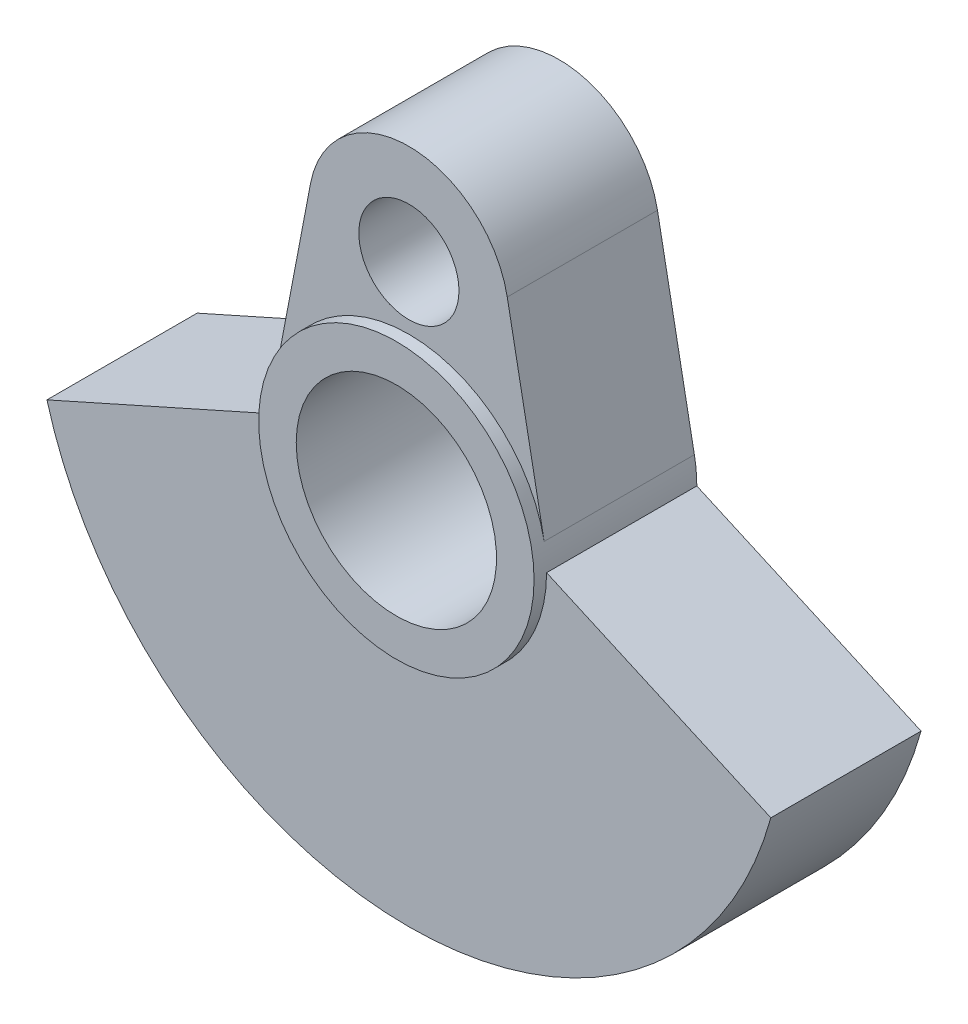
ISO-10303-21;
HEADER;
FILE_DESCRIPTION(('STEP AP214'),'2;1');
FILE_NAME('part.step','',(''),(''),'','','');
FILE_SCHEMA(('AUTOMOTIVE_DESIGN { 1 0 10303 214 1 1 1 1 }'));
ENDSEC;
DATA;
#1=APPLICATION_CONTEXT('core data for automotive mechanical design processes');
#2=APPLICATION_PROTOCOL_DEFINITION('international standard','automotive_design',2000,#1);
#3=PRODUCT_CONTEXT('',#1,'mechanical');
#4=PRODUCT('Part','Part','',(#3));
#5=PRODUCT_RELATED_PRODUCT_CATEGORY('part','',(#4));
#6=PRODUCT_DEFINITION_FORMATION('','',#4);
#7=PRODUCT_DEFINITION_CONTEXT('part definition',#1,'design');
#8=PRODUCT_DEFINITION('design','',#6,#7);
#9=PRODUCT_DEFINITION_SHAPE('','',#8);
#10=(LENGTH_UNIT() NAMED_UNIT(*) SI_UNIT(.MILLI.,.METRE.));
#11=(NAMED_UNIT(*) PLANE_ANGLE_UNIT() SI_UNIT($,.RADIAN.));
#12=(NAMED_UNIT(*) SI_UNIT($,.STERADIAN.) SOLID_ANGLE_UNIT());
#13=UNCERTAINTY_MEASURE_WITH_UNIT(LENGTH_MEASURE(1.E-05),#10,'distance_accuracy_value','');
#14=(GEOMETRIC_REPRESENTATION_CONTEXT(3) GLOBAL_UNCERTAINTY_ASSIGNED_CONTEXT((#13)) GLOBAL_UNIT_ASSIGNED_CONTEXT((#10,
#11,#12)) REPRESENTATION_CONTEXT('',''));
#15=CARTESIAN_POINT('',(0.,0.,0.));
#16=DIRECTION('',(0.,0.,1.));
#17=DIRECTION('',(1.,0.,0.));
#18=AXIS2_PLACEMENT_3D('',#15,#16,#17);
#19=CARTESIAN_POINT('',(0.,0.,3.5));
#20=DIRECTION('',(0.,0.,-1.));
#21=DIRECTION('',(-1.,0.,0.));
#22=AXIS2_PLACEMENT_3D('',#19,#20,#21);
#23=CYLINDRICAL_SURFACE('',#22,5.5);
#24=CARTESIAN_POINT('',(0.,0.,3.5));
#25=DIRECTION('',(0.,0.,1.));
#26=DIRECTION('',(1.,0.,0.));
#27=AXIS2_PLACEMENT_3D('',#24,#25,#26);
#28=CIRCLE('',#27,5.5);
#29=CARTESIAN_POINT('',(5.5,0.,3.5));
#30=VERTEX_POINT('',#29);
#31=EDGE_CURVE('E153',#30,#30,#28,.T.);
#32=ORIENTED_EDGE('',*,*,#31,.F.);
#33=EDGE_LOOP('',(#32));
#34=FACE_BOUND('',#33,.T.);
#35=DIRECTION('',(0.,0.,-1.));
#36=VECTOR('',#35,1.);
#37=CARTESIAN_POINT('',(5.40245531564122,1.03125,3.));
#38=LINE('',#37,#36);
#39=CARTESIAN_POINT('',(5.40245531564122,1.03125,3.));
#40=VERTEX_POINT('',#39);
#41=CARTESIAN_POINT('',(5.40245531564121,1.03125,-3.));
#42=VERTEX_POINT('',#41);
#43=EDGE_CURVE('E62',#40,#42,#38,.T.);
#44=ORIENTED_EDGE('',*,*,#43,.F.);
#45=CARTESIAN_POINT('',(0.,0.,3.));
#46=DIRECTION('',(0.,0.,1.));
#47=DIRECTION('',(1.,0.,0.));
#48=AXIS2_PLACEMENT_3D('',#45,#46,#47);
#49=CIRCLE('',#48,5.5);
#50=CARTESIAN_POINT('',(-5.40245531564122,1.03125,3.));
#51=VERTEX_POINT('',#50);
#52=EDGE_CURVE('E57',#40,#51,#49,.T.);
#53=ORIENTED_EDGE('',*,*,#52,.T.);
#54=DIRECTION('',(0.,0.,-1.));
#55=VECTOR('',#54,1.);
#56=CARTESIAN_POINT('',(-5.40245531564122,1.03125,3.));
#57=LINE('',#56,#55);
#58=CARTESIAN_POINT('',(-5.40245531564122,1.03125,-3.));
#59=VERTEX_POINT('',#58);
#60=EDGE_CURVE('E144',#51,#59,#57,.T.);
#61=ORIENTED_EDGE('',*,*,#60,.T.);
#62=CARTESIAN_POINT('',(0.,0.,-3.));
#63=DIRECTION('',(0.,0.,1.));
#64=DIRECTION('',(1.,0.,0.));
#65=AXIS2_PLACEMENT_3D('',#62,#63,#64);
#66=CIRCLE('',#65,5.5);
#67=CARTESIAN_POINT('',(-5.5,0.,-3.));
#68=VERTEX_POINT('',#67);
#69=EDGE_CURVE('E150',#59,#68,#66,.T.);
#70=ORIENTED_EDGE('',*,*,#69,.T.);
#71=DIRECTION('',(0.,0.,-1.));
#72=VECTOR('',#71,1.);
#73=CARTESIAN_POINT('',(-5.5,0.,3.));
#74=LINE('',#73,#72);
#75=CARTESIAN_POINT('',(-5.5,0.,3.));
#76=VERTEX_POINT('',#75);
#77=EDGE_CURVE('E170',#76,#68,#74,.T.);
#78=ORIENTED_EDGE('',*,*,#77,.F.);
#79=CARTESIAN_POINT('',(0.,0.,3.));
#80=DIRECTION('',(0.,0.,1.));
#81=DIRECTION('',(1.,0.,0.));
#82=AXIS2_PLACEMENT_3D('',#79,#80,#81);
#83=CIRCLE('',#82,5.5);
#84=CARTESIAN_POINT('',(5.5,0.,3.));
#85=VERTEX_POINT('',#84);
#86=EDGE_CURVE('E168',#76,#85,#83,.T.);
#87=ORIENTED_EDGE('',*,*,#86,.T.);
#88=DIRECTION('',(0.,0.,-1.));
#89=VECTOR('',#88,1.);
#90=CARTESIAN_POINT('',(5.5,0.,3.));
#91=LINE('',#90,#89);
#92=CARTESIAN_POINT('',(5.5,0.,-3.));
#93=VERTEX_POINT('',#92);
#94=EDGE_CURVE('E180',#85,#93,#91,.T.);
#95=ORIENTED_EDGE('',*,*,#94,.T.);
#96=EDGE_CURVE('E157',#93,#42,#66,.T.);
#97=ORIENTED_EDGE('',*,*,#96,.T.);
#98=EDGE_LOOP('',(#44,#53,#61,#70,#78,#87,#95,#97));
#99=FACE_BOUND('',#98,.T.);
#100=ADVANCED_FACE('F42',(#34,#99),#23,.T.);
#101=CARTESIAN_POINT('',(-0.91452472822436,2.04781115503851,3.));
#102=DIRECTION('',(-0.407771042759929,0.9130842111692,0.));
#103=DIRECTION('',(-0.9130842111692,-0.407771042759929,0.));
#104=AXIS2_PLACEMENT_3D('',#101,#102,#103);
#105=PLANE('',#104);
#106=DIRECTION('',(0.9130842111692,0.407771042759929,0.));
#107=VECTOR('',#106,1.);
#108=CARTESIAN_POINT('',(-0.91452472822436,2.04781115503851,-3.));
#109=LINE('',#108,#107);
#110=CARTESIAN_POINT('',(-14.456832294801,-4.,-3.));
#111=VERTEX_POINT('',#110);
#112=EDGE_CURVE('E156',#111,#68,#109,.T.);
#113=ORIENTED_EDGE('',*,*,#112,.F.);
#114=DIRECTION('',(0.,0.,-1.));
#115=VECTOR('',#114,1.);
#116=CARTESIAN_POINT('',(-14.456832294801,-4.,3.));
#117=LINE('',#116,#115);
#118=CARTESIAN_POINT('',(-14.456832294801,-4.,3.));
#119=VERTEX_POINT('',#118);
#120=EDGE_CURVE('E12',#119,#111,#117,.T.);
#121=ORIENTED_EDGE('',*,*,#120,.F.);
#122=DIRECTION('',(0.9130842111692,0.407771042759929,0.));
#123=VECTOR('',#122,1.);
#124=CARTESIAN_POINT('',(-0.91452472822436,2.04781115503851,3.));
#125=LINE('',#124,#123);
#126=EDGE_CURVE('E159',#119,#76,#125,.T.);
#127=ORIENTED_EDGE('',*,*,#126,.T.);
#128=ORIENTED_EDGE('',*,*,#77,.T.);
#129=EDGE_LOOP('',(#113,#121,#127,#128));
#130=FACE_BOUND('',#129,.T.);
#131=ADVANCED_FACE('F44',(#130),#105,.T.);
#132=CARTESIAN_POINT('',(0.,0.,3.));
#133=DIRECTION('',(0.,0.,-1.));
#134=DIRECTION('',(-1.,0.,0.));
#135=AXIS2_PLACEMENT_3D('',#132,#133,#134);
#136=CYLINDRICAL_SURFACE('',#135,15.);
#137=CARTESIAN_POINT('',(0.,0.,-3.));
#138=DIRECTION('',(0.,0.,1.));
#139=DIRECTION('',(1.,0.,0.));
#140=AXIS2_PLACEMENT_3D('',#137,#138,#139);
#141=CIRCLE('',#140,15.);
#142=CARTESIAN_POINT('',(14.456832294801,-4.,-3.));
#143=VERTEX_POINT('',#142);
#144=EDGE_CURVE('E173',#111,#143,#141,.T.);
#145=ORIENTED_EDGE('',*,*,#144,.T.);
#146=DIRECTION('',(0.,0.,-1.));
#147=VECTOR('',#146,1.);
#148=CARTESIAN_POINT('',(14.456832294801,-4.,3.));
#149=LINE('',#148,#147);
#150=CARTESIAN_POINT('',(14.456832294801,-4.,3.));
#151=VERTEX_POINT('',#150);
#152=EDGE_CURVE('E50',#151,#143,#149,.T.);
#153=ORIENTED_EDGE('',*,*,#152,.F.);
#154=CARTESIAN_POINT('',(0.,0.,3.));
#155=DIRECTION('',(0.,0.,1.));
#156=DIRECTION('',(1.,0.,0.));
#157=AXIS2_PLACEMENT_3D('',#154,#155,#156);
#158=CIRCLE('',#157,15.);
#159=EDGE_CURVE('E162',#119,#151,#158,.T.);
#160=ORIENTED_EDGE('',*,*,#159,.F.);
#161=ORIENTED_EDGE('',*,*,#120,.T.);
#162=EDGE_LOOP('',(#145,#153,#160,#161));
#163=FACE_BOUND('',#162,.T.);
#164=ADVANCED_FACE('F191',(#163),#136,.T.);
#165=CARTESIAN_POINT('',(0.91452472822436,2.04781115503851,3.));
#166=DIRECTION('',(0.407771042759929,0.9130842111692,0.));
#167=DIRECTION('',(-0.9130842111692,0.407771042759929,0.));
#168=AXIS2_PLACEMENT_3D('',#165,#166,#167);
#169=PLANE('',#168);
#170=DIRECTION('',(0.9130842111692,-0.407771042759929,0.));
#171=VECTOR('',#170,1.);
#172=CARTESIAN_POINT('',(0.91452472822436,2.04781115503851,-3.));
#173=LINE('',#172,#171);
#174=EDGE_CURVE('E163',#93,#143,#173,.T.);
#175=ORIENTED_EDGE('',*,*,#174,.F.);
#176=ORIENTED_EDGE('',*,*,#94,.F.);
#177=DIRECTION('',(0.9130842111692,-0.407771042759929,0.));
#178=VECTOR('',#177,1.);
#179=CARTESIAN_POINT('',(0.91452472822436,2.04781115503851,3.));
#180=LINE('',#179,#178);
#181=EDGE_CURVE('E165',#85,#151,#180,.T.);
#182=ORIENTED_EDGE('',*,*,#181,.T.);
#183=ORIENTED_EDGE('',*,*,#152,.T.);
#184=EDGE_LOOP('',(#175,#176,#182,#183));
#185=FACE_BOUND('',#184,.T.);
#186=ADVANCED_FACE('F185',(#185),#169,.T.);
#187=CARTESIAN_POINT('',(0.,0.,3.));
#188=DIRECTION('',(0.,0.,1.));
#189=DIRECTION('',(1.,0.,0.));
#190=AXIS2_PLACEMENT_3D('',#187,#188,#189);
#191=PLANE('',#190);
#192=ORIENTED_EDGE('',*,*,#126,.F.);
#193=ORIENTED_EDGE('',*,*,#159,.T.);
#194=ORIENTED_EDGE('',*,*,#181,.F.);
#195=ORIENTED_EDGE('',*,*,#86,.F.);
#196=EDGE_LOOP('',(#192,#193,#194,#195));
#197=FACE_BOUND('',#196,.T.);
#198=ADVANCED_FACE('F199',(#197),#191,.T.);
#199=CARTESIAN_POINT('',(0.,0.,-3.));
#200=DIRECTION('',(0.,0.,1.));
#201=DIRECTION('',(1.,0.,0.));
#202=AXIS2_PLACEMENT_3D('',#199,#200,#201);
#203=PLANE('',#202);
#204=ORIENTED_EDGE('',*,*,#112,.T.);
#205=ORIENTED_EDGE('',*,*,#69,.F.);
#206=DIRECTION('',(-0.1875,-0.982264602843857,0.));
#207=VECTOR('',#206,1.);
#208=CARTESIAN_POINT('',(-5.40245531564122,1.03125,-3.));
#209=LINE('',#208,#207);
#210=CARTESIAN_POINT('',(-3.92905841137543,8.75,-3.));
#211=VERTEX_POINT('',#210);
#212=EDGE_CURVE('E130',#211,#59,#209,.T.);
#213=ORIENTED_EDGE('',*,*,#212,.F.);
#214=CARTESIAN_POINT('',(0.,8.,-3.));
#215=DIRECTION('',(0.,0.,1.));
#216=DIRECTION('',(1.,0.,0.));
#217=AXIS2_PLACEMENT_3D('',#214,#215,#216);
#218=CIRCLE('',#217,4.);
#219=CARTESIAN_POINT('',(3.92905841137543,8.75,-3.));
#220=VERTEX_POINT('',#219);
#221=EDGE_CURVE('E139',#220,#211,#218,.T.);
#222=ORIENTED_EDGE('',*,*,#221,.F.);
#223=DIRECTION('',(0.1875,-0.982264602843857,0.));
#224=VECTOR('',#223,1.);
#225=CARTESIAN_POINT('',(5.40245531564122,1.03125,-3.));
#226=LINE('',#225,#224);
#227=EDGE_CURVE('E111',#220,#42,#226,.T.);
#228=ORIENTED_EDGE('',*,*,#227,.T.);
#229=ORIENTED_EDGE('',*,*,#96,.F.);
#230=ORIENTED_EDGE('',*,*,#174,.T.);
#231=ORIENTED_EDGE('',*,*,#144,.F.);
#232=EDGE_LOOP('',(#204,#205,#213,#222,#228,#229,#230,#231));
#233=FACE_BOUND('',#232,.T.);
#234=CARTESIAN_POINT('',(0.,0.,-3.));
#235=DIRECTION('',(0.,0.,1.));
#236=DIRECTION('',(1.,0.,0.));
#237=AXIS2_PLACEMENT_3D('',#234,#235,#236);
#238=CIRCLE('',#237,4.);
#239=CARTESIAN_POINT('',(-4.,0.,-3.));
#240=VERTEX_POINT('',#239);
#241=EDGE_CURVE('E115',#240,#240,#238,.T.);
#242=ORIENTED_EDGE('',*,*,#241,.T.);
#243=EDGE_LOOP('',(#242));
#244=FACE_BOUND('',#243,.T.);
#245=CARTESIAN_POINT('',(0.,8.,-3.));
#246=DIRECTION('',(0.,0.,1.));
#247=DIRECTION('',(1.,0.,0.));
#248=AXIS2_PLACEMENT_3D('',#245,#246,#247);
#249=CIRCLE('',#248,2.);
#250=CARTESIAN_POINT('',(2.,8.,-3.));
#251=VERTEX_POINT('',#250);
#252=EDGE_CURVE('E135',#251,#251,#249,.T.);
#253=ORIENTED_EDGE('',*,*,#252,.T.);
#254=EDGE_LOOP('',(#253));
#255=FACE_BOUND('',#254,.T.);
#256=ADVANCED_FACE('F194',(#233,#244,#255),#203,.F.);
#257=CARTESIAN_POINT('',(0.,0.,3.5));
#258=DIRECTION('',(0.,0.,1.));
#259=DIRECTION('',(1.,0.,0.));
#260=AXIS2_PLACEMENT_3D('',#257,#258,#259);
#261=PLANE('',#260);
#262=ORIENTED_EDGE('',*,*,#31,.T.);
#263=EDGE_LOOP('',(#262));
#264=FACE_BOUND('',#263,.T.);
#265=CARTESIAN_POINT('',(0.,0.,3.5));
#266=DIRECTION('',(0.,0.,1.));
#267=DIRECTION('',(1.,0.,0.));
#268=AXIS2_PLACEMENT_3D('',#265,#266,#267);
#269=CIRCLE('',#268,4.);
#270=CARTESIAN_POINT('',(-4.,0.,3.5));
#271=VERTEX_POINT('',#270);
#272=EDGE_CURVE('E147',#271,#271,#269,.T.);
#273=ORIENTED_EDGE('',*,*,#272,.F.);
#274=EDGE_LOOP('',(#273));
#275=FACE_BOUND('',#274,.T.);
#276=ADVANCED_FACE('F224',(#264,#275),#261,.T.);
#277=CARTESIAN_POINT('',(0.,0.,3.5));
#278=DIRECTION('',(0.,0.,-1.));
#279=DIRECTION('',(-1.,0.,0.));
#280=AXIS2_PLACEMENT_3D('',#277,#278,#279);
#281=CYLINDRICAL_SURFACE('',#280,4.);
#282=CARTESIAN_POINT('',(-4.,0.,3.5));
#283=CARTESIAN_POINT('',(-4.,0.,3.43229166666667));
#284=CARTESIAN_POINT('',(-4.,0.,3.36458333333333));
#285=CARTESIAN_POINT('',(-4.,0.,3.22916666666667));
#286=CARTESIAN_POINT('',(-4.,0.,3.16145833333333));
#287=CARTESIAN_POINT('',(-4.,0.,3.02604166666667));
#288=CARTESIAN_POINT('',(-4.,0.,2.95833333333333));
#289=CARTESIAN_POINT('',(-4.,0.,2.82291666666667));
#290=CARTESIAN_POINT('',(-4.,0.,2.75520833333333));
#291=CARTESIAN_POINT('',(-4.,0.,2.61979166666667));
#292=CARTESIAN_POINT('',(-4.,0.,2.55208333333333));
#293=CARTESIAN_POINT('',(-4.,0.,2.41666666666667));
#294=CARTESIAN_POINT('',(-4.,0.,2.34895833333333));
#295=CARTESIAN_POINT('',(-4.,0.,2.21354166666667));
#296=CARTESIAN_POINT('',(-4.,0.,2.14583333333333));
#297=CARTESIAN_POINT('',(-4.,0.,2.01041666666667));
#298=CARTESIAN_POINT('',(-4.,0.,1.94270833333333));
#299=CARTESIAN_POINT('',(-4.,0.,1.80729166666667));
#300=CARTESIAN_POINT('',(-4.,0.,1.73958333333333));
#301=CARTESIAN_POINT('',(-4.,0.,1.60416666666667));
#302=CARTESIAN_POINT('',(-4.,0.,1.53645833333333));
#303=CARTESIAN_POINT('',(-4.,0.,1.40104166666667));
#304=CARTESIAN_POINT('',(-4.,0.,1.33333333333333));
#305=CARTESIAN_POINT('',(-4.,0.,1.19791666666667));
#306=CARTESIAN_POINT('',(-4.,0.,1.13020833333333));
#307=CARTESIAN_POINT('',(-4.,0.,0.994791666666666));
#308=CARTESIAN_POINT('',(-4.,0.,0.927083333333333));
#309=CARTESIAN_POINT('',(-4.,0.,0.791666666666666));
#310=CARTESIAN_POINT('',(-4.,0.,0.723958333333333));
#311=CARTESIAN_POINT('',(-4.,0.,0.588541666666666));
#312=CARTESIAN_POINT('',(-4.,0.,0.520833333333333));
#313=CARTESIAN_POINT('',(-4.,0.,0.385416666666666));
#314=CARTESIAN_POINT('',(-4.,0.,0.317708333333333));
#315=CARTESIAN_POINT('',(-4.,0.,0.182291666666666));
#316=CARTESIAN_POINT('',(-4.,0.,0.114583333333333));
#317=CARTESIAN_POINT('',(-4.,0.,-0.0208333333333341));
#318=CARTESIAN_POINT('',(-4.,0.,-0.0885416666666673));
#319=CARTESIAN_POINT('',(-4.,0.,-0.223958333333334));
#320=CARTESIAN_POINT('',(-4.,0.,-0.291666666666667));
#321=CARTESIAN_POINT('',(-4.,0.,-0.427083333333334));
#322=CARTESIAN_POINT('',(-4.,0.,-0.494791666666667));
#323=CARTESIAN_POINT('',(-4.,0.,-0.630208333333333));
#324=CARTESIAN_POINT('',(-4.,0.,-0.697916666666666));
#325=CARTESIAN_POINT('',(-4.,0.,-0.833333333333333));
#326=CARTESIAN_POINT('',(-4.,0.,-0.901041666666667));
#327=CARTESIAN_POINT('',(-4.,0.,-1.03645833333333));
#328=CARTESIAN_POINT('',(-4.,0.,-1.10416666666667));
#329=CARTESIAN_POINT('',(-4.,0.,-1.23958333333333));
#330=CARTESIAN_POINT('',(-4.,0.,-1.30729166666667));
#331=CARTESIAN_POINT('',(-4.,0.,-1.44270833333333));
#332=CARTESIAN_POINT('',(-4.,0.,-1.51041666666667));
#333=CARTESIAN_POINT('',(-4.,0.,-1.64583333333333));
#334=CARTESIAN_POINT('',(-4.,0.,-1.71354166666667));
#335=CARTESIAN_POINT('',(-4.,0.,-1.84895833333333));
#336=CARTESIAN_POINT('',(-4.,0.,-1.91666666666667));
#337=CARTESIAN_POINT('',(-4.,0.,-2.05208333333333));
#338=CARTESIAN_POINT('',(-4.,0.,-2.11979166666667));
#339=CARTESIAN_POINT('',(-4.,0.,-2.25520833333333));
#340=CARTESIAN_POINT('',(-4.,0.,-2.32291666666667));
#341=CARTESIAN_POINT('',(-4.,0.,-2.45833333333333));
#342=CARTESIAN_POINT('',(-4.,0.,-2.52604166666667));
#343=CARTESIAN_POINT('',(-4.,0.,-2.66145833333333));
#344=CARTESIAN_POINT('',(-4.,0.,-2.72916666666667));
#345=CARTESIAN_POINT('',(-4.,0.,-2.86458333333333));
#346=CARTESIAN_POINT('',(-4.,0.,-2.93229166666667));
#347=CARTESIAN_POINT('',(-4.,0.,-3.));
#348=B_SPLINE_CURVE_WITH_KNOTS('',3,(#282,#283,#284,#285,#286,#287,#288,#289,#290,#291,#292,
#293,#294,#295,#296,#297,#298,#299,#300,#301,#302,#303,#304,#305,#306,#307,#308,#309,#310,#311,
#312,#313,#314,#315,#316,#317,#318,#319,#320,#321,#322,#323,#324,#325,#326,#327,#328,#329,#330,
#331,#332,#333,#334,#335,#336,#337,#338,#339,#340,#341,#342,#343,#344,#345,#346,#347),
.UNSPECIFIED.,.F.,.F.,(4,2,2,2,2,2,2,2,2,2,2,2,2,2,2,2,2,2,2,2,2,2,2,2,2,2,2,2,2,2,2,2,4),(0.,
0.203125,0.40625,0.609375,0.8125,1.015625,1.21875,1.421875,1.625,1.828125,2.03125,2.234375,
2.4375,2.640625,2.84375,3.046875,3.25,3.453125,3.65625,3.859375,4.0625,4.265625,4.46875,
4.671875,4.875,5.078125,5.28125,5.484375,5.6875,5.890625,6.09375,6.296875,6.5),.UNSPECIFIED.);
#349=EDGE_CURVE('BSEAM254',#271,#240,#348,.T.);
#350=ORIENTED_EDGE('',*,*,#272,.T.);
#351=ORIENTED_EDGE('',*,*,#241,.F.);
#352=ORIENTED_EDGE('',*,*,#349,.T.);
#353=ORIENTED_EDGE('',*,*,#349,.F.);
#354=EDGE_LOOP('',(#350,#352,#351,#353));
#355=FACE_BOUND('',#354,.T.);
#356=ADVANCED_FACE('F254',(#355),#281,.F.);
#357=CARTESIAN_POINT('',(5.40245531564122,1.03125,3.));
#358=DIRECTION('',(0.982264602843857,0.1875,0.));
#359=DIRECTION('',(-0.1875,0.982264602843857,0.));
#360=AXIS2_PLACEMENT_3D('',#357,#358,#359);
#361=PLANE('',#360);
#362=ORIENTED_EDGE('',*,*,#227,.F.);
#363=DIRECTION('',(0.,0.,-1.));
#364=VECTOR('',#363,1.);
#365=CARTESIAN_POINT('',(3.92905841137543,8.75,3.));
#366=LINE('',#365,#364);
#367=CARTESIAN_POINT('',(3.92905841137543,8.75,3.));
#368=VERTEX_POINT('',#367);
#369=EDGE_CURVE('E105',#368,#220,#366,.T.);
#370=ORIENTED_EDGE('',*,*,#369,.F.);
#371=DIRECTION('',(0.1875,-0.982264602843857,0.));
#372=VECTOR('',#371,1.);
#373=CARTESIAN_POINT('',(5.40245531564122,1.03125,3.));
#374=LINE('',#373,#372);
#375=EDGE_CURVE('E109',#368,#40,#374,.T.);
#376=ORIENTED_EDGE('',*,*,#375,.T.);
#377=ORIENTED_EDGE('',*,*,#43,.T.);
#378=EDGE_LOOP('',(#362,#370,#376,#377));
#379=FACE_BOUND('',#378,.T.);
#380=ADVANCED_FACE('F107',(#379),#361,.T.);
#381=CARTESIAN_POINT('',(0.,8.,3.));
#382=DIRECTION('',(0.,0.,-1.));
#383=DIRECTION('',(-1.,0.,0.));
#384=AXIS2_PLACEMENT_3D('',#381,#382,#383);
#385=CYLINDRICAL_SURFACE('',#384,4.);
#386=ORIENTED_EDGE('',*,*,#221,.T.);
#387=DIRECTION('',(0.,0.,-1.));
#388=VECTOR('',#387,1.);
#389=CARTESIAN_POINT('',(-3.92905841137543,8.75,3.));
#390=LINE('',#389,#388);
#391=CARTESIAN_POINT('',(-3.92905841137543,8.75,3.));
#392=VERTEX_POINT('',#391);
#393=EDGE_CURVE('E116',#392,#211,#390,.T.);
#394=ORIENTED_EDGE('',*,*,#393,.F.);
#395=CARTESIAN_POINT('',(0.,8.,3.));
#396=DIRECTION('',(0.,0.,1.));
#397=DIRECTION('',(1.,0.,0.));
#398=AXIS2_PLACEMENT_3D('',#395,#396,#397);
#399=CIRCLE('',#398,4.);
#400=EDGE_CURVE('E120',#368,#392,#399,.T.);
#401=ORIENTED_EDGE('',*,*,#400,.F.);
#402=ORIENTED_EDGE('',*,*,#369,.T.);
#403=EDGE_LOOP('',(#386,#394,#401,#402));
#404=FACE_BOUND('',#403,.T.);
#405=ADVANCED_FACE('F121',(#404),#385,.T.);
#406=CARTESIAN_POINT('',(-5.40245531564122,1.03125,3.));
#407=DIRECTION('',(0.982264602843857,-0.1875,0.));
#408=DIRECTION('',(0.1875,0.982264602843857,0.));
#409=AXIS2_PLACEMENT_3D('',#406,#407,#408);
#410=PLANE('',#409);
#411=ORIENTED_EDGE('',*,*,#212,.T.);
#412=ORIENTED_EDGE('',*,*,#60,.F.);
#413=DIRECTION('',(-0.1875,-0.982264602843857,0.));
#414=VECTOR('',#413,1.);
#415=CARTESIAN_POINT('',(-5.40245531564122,1.03125,3.));
#416=LINE('',#415,#414);
#417=EDGE_CURVE('E124',#392,#51,#416,.T.);
#418=ORIENTED_EDGE('',*,*,#417,.F.);
#419=ORIENTED_EDGE('',*,*,#393,.T.);
#420=EDGE_LOOP('',(#411,#412,#418,#419));
#421=FACE_BOUND('',#420,.T.);
#422=ADVANCED_FACE('F203',(#421),#410,.F.);
#423=CARTESIAN_POINT('',(0.,8.,3.));
#424=DIRECTION('',(0.,0.,-1.));
#425=DIRECTION('',(-1.,0.,0.));
#426=AXIS2_PLACEMENT_3D('',#423,#424,#425);
#427=CYLINDRICAL_SURFACE('',#426,2.);
#428=CARTESIAN_POINT('',(0.,8.,3.));
#429=DIRECTION('',(0.,0.,1.));
#430=DIRECTION('',(1.,0.,0.));
#431=AXIS2_PLACEMENT_3D('',#428,#429,#430);
#432=CIRCLE('',#431,2.);
#433=CARTESIAN_POINT('',(2.,8.,3.));
#434=VERTEX_POINT('',#433);
#435=EDGE_CURVE('E127',#434,#434,#432,.T.);
#436=ORIENTED_EDGE('',*,*,#435,.T.);
#437=EDGE_LOOP('',(#436));
#438=FACE_BOUND('',#437,.T.);
#439=ORIENTED_EDGE('',*,*,#252,.F.);
#440=EDGE_LOOP('',(#439));
#441=FACE_BOUND('',#440,.T.);
#442=ADVANCED_FACE('F205',(#438,#441),#427,.F.);
#443=CARTESIAN_POINT('',(0.,0.,3.));
#444=DIRECTION('',(0.,0.,1.));
#445=DIRECTION('',(1.,0.,0.));
#446=AXIS2_PLACEMENT_3D('',#443,#444,#445);
#447=PLANE('',#446);
#448=ORIENTED_EDGE('',*,*,#435,.F.);
#449=EDGE_LOOP('',(#448));
#450=FACE_BOUND('',#449,.T.);
#451=ORIENTED_EDGE('',*,*,#375,.F.);
#452=ORIENTED_EDGE('',*,*,#400,.T.);
#453=ORIENTED_EDGE('',*,*,#417,.T.);
#454=ORIENTED_EDGE('',*,*,#52,.F.);
#455=EDGE_LOOP('',(#451,#452,#453,#454));
#456=FACE_BOUND('',#455,.T.);
#457=ADVANCED_FACE('F126',(#450,#456),#447,.T.);
#458=CLOSED_SHELL('',(#100,#131,#164,#186,#198,#256,#276,#356,#380,#405,#422,#442,#457));
#459=MANIFOLD_SOLID_BREP('B2',#458);
#460=ADVANCED_BREP_SHAPE_REPRESENTATION('',(#18,#459),#14);
#461=SHAPE_DEFINITION_REPRESENTATION(#9,#460);
ENDSEC;
END-ISO-10303-21;
